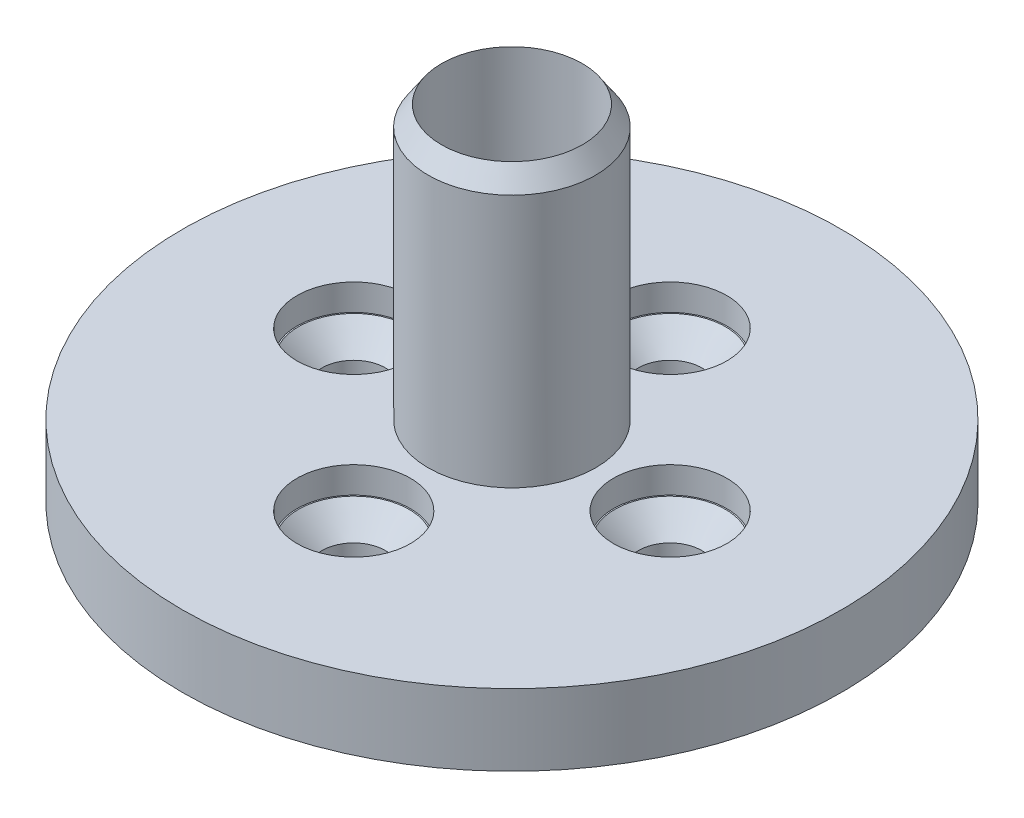
ISO-10303-21;
HEADER;
FILE_DESCRIPTION(('STEP AP214'),'2;1');
FILE_NAME('part.step','',(''),(''),'','','');
FILE_SCHEMA(('AUTOMOTIVE_DESIGN { 1 0 10303 214 1 1 1 1 }'));
ENDSEC;
DATA;
#1=APPLICATION_CONTEXT('core data for automotive mechanical design processes');
#2=APPLICATION_PROTOCOL_DEFINITION('international standard','automotive_design',2000,#1);
#3=PRODUCT_CONTEXT('',#1,'mechanical');
#4=PRODUCT('Part','Part','',(#3));
#5=PRODUCT_RELATED_PRODUCT_CATEGORY('part','',(#4));
#6=PRODUCT_DEFINITION_FORMATION('','',#4);
#7=PRODUCT_DEFINITION_CONTEXT('part definition',#1,'design');
#8=PRODUCT_DEFINITION('design','',#6,#7);
#9=PRODUCT_DEFINITION_SHAPE('','',#8);
#10=(LENGTH_UNIT() NAMED_UNIT(*) SI_UNIT(.MILLI.,.METRE.));
#11=(NAMED_UNIT(*) PLANE_ANGLE_UNIT() SI_UNIT($,.RADIAN.));
#12=(NAMED_UNIT(*) SI_UNIT($,.STERADIAN.) SOLID_ANGLE_UNIT());
#13=UNCERTAINTY_MEASURE_WITH_UNIT(LENGTH_MEASURE(1.E-05),#10,'distance_accuracy_value','');
#14=(GEOMETRIC_REPRESENTATION_CONTEXT(3) GLOBAL_UNCERTAINTY_ASSIGNED_CONTEXT((#13)) GLOBAL_UNIT_ASSIGNED_CONTEXT((#10,
#11,#12)) REPRESENTATION_CONTEXT('',''));
#15=CARTESIAN_POINT('',(0.,0.,0.));
#16=DIRECTION('',(0.,0.,1.));
#17=DIRECTION('',(1.,0.,0.));
#18=AXIS2_PLACEMENT_3D('',#15,#16,#17);
#19=CARTESIAN_POINT('',(6.,2.715,0.));
#20=DIRECTION('',(0.,-1.,0.));
#21=DIRECTION('',(0.,0.,-1.));
#22=AXIS2_PLACEMENT_3D('',#19,#20,#21);
#23=CYLINDRICAL_SURFACE('',#22,1.2);
#24=CARTESIAN_POINT('',(6.,0.814999999999995,0.));
#25=DIRECTION('',(0.,1.,0.));
#26=DIRECTION('',(0.,0.,1.));
#27=AXIS2_PLACEMENT_3D('',#24,#25,#26);
#28=CIRCLE('',#27,1.2);
#29=CARTESIAN_POINT('',(6.,0.814999999999995,1.2));
#30=VERTEX_POINT('',#29);
#31=EDGE_CURVE('E69',#30,#30,#28,.T.);
#32=ORIENTED_EDGE('',*,*,#31,.T.);
#33=EDGE_LOOP('',(#32));
#34=FACE_BOUND('',#33,.T.);
#35=CARTESIAN_POINT('',(6.,0.,0.));
#36=DIRECTION('',(0.,1.,0.));
#37=DIRECTION('',(0.,0.,1.));
#38=AXIS2_PLACEMENT_3D('',#35,#36,#37);
#39=CIRCLE('',#38,1.2);
#40=CARTESIAN_POINT('',(6.,0.,1.2));
#41=VERTEX_POINT('',#40);
#42=EDGE_CURVE('E82',#41,#41,#39,.T.);
#43=ORIENTED_EDGE('',*,*,#42,.F.);
#44=EDGE_LOOP('',(#43));
#45=FACE_BOUND('',#44,.T.);
#46=ADVANCED_FACE('F40',(#34,#45),#23,.F.);
#47=CARTESIAN_POINT('',(0.,2.715,-6.));
#48=DIRECTION('',(0.,-1.,0.));
#49=DIRECTION('',(0.,0.,-1.));
#50=AXIS2_PLACEMENT_3D('',#47,#48,#49);
#51=CYLINDRICAL_SURFACE('',#50,1.2);
#52=CARTESIAN_POINT('',(0.,0.814999999999995,-6.));
#53=DIRECTION('',(0.,1.,0.));
#54=DIRECTION('',(0.,0.,1.));
#55=AXIS2_PLACEMENT_3D('',#52,#53,#54);
#56=CIRCLE('',#55,1.2);
#57=CARTESIAN_POINT('',(0.,0.814999999999995,-4.8));
#58=VERTEX_POINT('',#57);
#59=EDGE_CURVE('E55',#58,#58,#56,.T.);
#60=ORIENTED_EDGE('',*,*,#59,.T.);
#61=EDGE_LOOP('',(#60));
#62=FACE_BOUND('',#61,.T.);
#63=CARTESIAN_POINT('',(0.,0.,-6.));
#64=DIRECTION('',(0.,1.,0.));
#65=DIRECTION('',(0.,0.,1.));
#66=AXIS2_PLACEMENT_3D('',#63,#64,#65);
#67=CIRCLE('',#66,1.2);
#68=CARTESIAN_POINT('',(0.,0.,-4.8));
#69=VERTEX_POINT('',#68);
#70=EDGE_CURVE('E85',#69,#69,#67,.T.);
#71=ORIENTED_EDGE('',*,*,#70,.F.);
#72=EDGE_LOOP('',(#71));
#73=FACE_BOUND('',#72,.T.);
#74=ADVANCED_FACE('F142',(#62,#73),#51,.F.);
#75=CARTESIAN_POINT('',(-6.,2.715,0.));
#76=DIRECTION('',(0.,-1.,0.));
#77=DIRECTION('',(0.,0.,-1.));
#78=AXIS2_PLACEMENT_3D('',#75,#76,#77);
#79=CYLINDRICAL_SURFACE('',#78,1.2);
#80=CARTESIAN_POINT('',(-6.,0.814999999999995,0.));
#81=DIRECTION('',(0.,1.,0.));
#82=DIRECTION('',(0.,0.,1.));
#83=AXIS2_PLACEMENT_3D('',#80,#81,#82);
#84=CIRCLE('',#83,1.2);
#85=CARTESIAN_POINT('',(-6.,0.814999999999995,1.2));
#86=VERTEX_POINT('',#85);
#87=EDGE_CURVE('E63',#86,#86,#84,.T.);
#88=ORIENTED_EDGE('',*,*,#87,.T.);
#89=EDGE_LOOP('',(#88));
#90=FACE_BOUND('',#89,.T.);
#91=CARTESIAN_POINT('',(-6.,0.,0.));
#92=DIRECTION('',(0.,1.,0.));
#93=DIRECTION('',(0.,0.,1.));
#94=AXIS2_PLACEMENT_3D('',#91,#92,#93);
#95=CIRCLE('',#94,1.2);
#96=CARTESIAN_POINT('',(-6.,0.,1.2));
#97=VERTEX_POINT('',#96);
#98=EDGE_CURVE('E88',#97,#97,#95,.T.);
#99=ORIENTED_EDGE('',*,*,#98,.F.);
#100=EDGE_LOOP('',(#99));
#101=FACE_BOUND('',#100,.T.);
#102=ADVANCED_FACE('F148',(#90,#101),#79,.F.);
#103=CARTESIAN_POINT('',(0.,2.715,6.));
#104=DIRECTION('',(0.,-1.,0.));
#105=DIRECTION('',(0.,0.,-1.));
#106=AXIS2_PLACEMENT_3D('',#103,#104,#105);
#107=CYLINDRICAL_SURFACE('',#106,1.2);
#108=CARTESIAN_POINT('',(0.,0.814999999999995,6.));
#109=DIRECTION('',(0.,1.,0.));
#110=DIRECTION('',(0.,0.,1.));
#111=AXIS2_PLACEMENT_3D('',#108,#109,#110);
#112=CIRCLE('',#111,1.2);
#113=CARTESIAN_POINT('',(0.,0.814999999999995,7.2));
#114=VERTEX_POINT('',#113);
#115=EDGE_CURVE('E75',#114,#114,#112,.T.);
#116=ORIENTED_EDGE('',*,*,#115,.T.);
#117=EDGE_LOOP('',(#116));
#118=FACE_BOUND('',#117,.T.);
#119=CARTESIAN_POINT('',(0.,0.,6.));
#120=DIRECTION('',(0.,1.,0.));
#121=DIRECTION('',(0.,0.,1.));
#122=AXIS2_PLACEMENT_3D('',#119,#120,#121);
#123=CIRCLE('',#122,1.2);
#124=CARTESIAN_POINT('',(0.,0.,7.2));
#125=VERTEX_POINT('',#124);
#126=EDGE_CURVE('E91',#125,#125,#123,.T.);
#127=ORIENTED_EDGE('',*,*,#126,.F.);
#128=EDGE_LOOP('',(#127));
#129=FACE_BOUND('',#128,.T.);
#130=ADVANCED_FACE('F158',(#118,#129),#107,.F.);
#131=CARTESIAN_POINT('',(0.,2.715,0.));
#132=DIRECTION('',(0.,-1.,0.));
#133=DIRECTION('',(0.,0.,-1.));
#134=AXIS2_PLACEMENT_3D('',#131,#132,#133);
#135=CYLINDRICAL_SURFACE('',#134,12.5);
#136=CARTESIAN_POINT('',(0.,2.715,0.));
#137=DIRECTION('',(0.,1.,0.));
#138=DIRECTION('',(0.,0.,1.));
#139=AXIS2_PLACEMENT_3D('',#136,#137,#138);
#140=CIRCLE('',#139,12.5);
#141=CARTESIAN_POINT('',(0.,2.715,12.5));
#142=VERTEX_POINT('',#141);
#143=EDGE_CURVE('E78',#142,#142,#140,.T.);
#144=ORIENTED_EDGE('',*,*,#143,.F.);
#145=EDGE_LOOP('',(#144));
#146=FACE_BOUND('',#145,.T.);
#147=CARTESIAN_POINT('',(0.,0.,0.));
#148=DIRECTION('',(0.,1.,0.));
#149=DIRECTION('',(0.,0.,1.));
#150=AXIS2_PLACEMENT_3D('',#147,#148,#149);
#151=CIRCLE('',#150,12.5);
#152=CARTESIAN_POINT('',(0.,0.,12.5));
#153=VERTEX_POINT('',#152);
#154=EDGE_CURVE('E79',#153,#153,#151,.T.);
#155=ORIENTED_EDGE('',*,*,#154,.T.);
#156=EDGE_LOOP('',(#155));
#157=FACE_BOUND('',#156,.T.);
#158=ADVANCED_FACE('F153',(#146,#157),#135,.T.);
#159=CARTESIAN_POINT('',(0.,2.715,0.));
#160=DIRECTION('',(0.,1.,0.));
#161=DIRECTION('',(0.,0.,1.));
#162=AXIS2_PLACEMENT_3D('',#159,#160,#161);
#163=PLANE('',#162);
#164=CARTESIAN_POINT('',(0.,2.715,-6.));
#165=DIRECTION('',(0.,1.,0.));
#166=DIRECTION('',(0.,0.,1.));
#167=AXIS2_PLACEMENT_3D('',#164,#165,#166);
#168=CIRCLE('',#167,2.15);
#169=CARTESIAN_POINT('',(0.,2.715,-3.85));
#170=VERTEX_POINT('',#169);
#171=EDGE_CURVE('E110',#170,#170,#168,.T.);
#172=ORIENTED_EDGE('',*,*,#171,.F.);
#173=EDGE_LOOP('',(#172));
#174=FACE_BOUND('',#173,.T.);
#175=CARTESIAN_POINT('',(0.,2.715,0.));
#176=DIRECTION('',(0.,1.,0.));
#177=DIRECTION('',(0.,0.,1.));
#178=AXIS2_PLACEMENT_3D('',#175,#176,#177);
#179=CIRCLE('',#178,3.175);
#180=CARTESIAN_POINT('',(0.,2.715,3.175));
#181=VERTEX_POINT('',#180);
#182=EDGE_CURVE('E111',#181,#181,#179,.T.);
#183=ORIENTED_EDGE('',*,*,#182,.F.);
#184=EDGE_LOOP('',(#183));
#185=FACE_BOUND('',#184,.T.);
#186=CARTESIAN_POINT('',(0.,2.715,6.));
#187=DIRECTION('',(0.,1.,0.));
#188=DIRECTION('',(0.,0.,1.));
#189=AXIS2_PLACEMENT_3D('',#186,#187,#188);
#190=CIRCLE('',#189,2.15);
#191=CARTESIAN_POINT('',(0.,2.715,8.15));
#192=VERTEX_POINT('',#191);
#193=EDGE_CURVE('E114',#192,#192,#190,.T.);
#194=ORIENTED_EDGE('',*,*,#193,.F.);
#195=EDGE_LOOP('',(#194));
#196=FACE_BOUND('',#195,.T.);
#197=CARTESIAN_POINT('',(6.,2.715,0.));
#198=DIRECTION('',(0.,1.,0.));
#199=DIRECTION('',(0.,0.,1.));
#200=AXIS2_PLACEMENT_3D('',#197,#198,#199);
#201=CIRCLE('',#200,2.15);
#202=CARTESIAN_POINT('',(6.,2.715,2.15));
#203=VERTEX_POINT('',#202);
#204=EDGE_CURVE('E97',#203,#203,#201,.T.);
#205=ORIENTED_EDGE('',*,*,#204,.F.);
#206=EDGE_LOOP('',(#205));
#207=FACE_BOUND('',#206,.T.);
#208=CARTESIAN_POINT('',(-6.,2.715,0.));
#209=DIRECTION('',(0.,1.,0.));
#210=DIRECTION('',(0.,0.,1.));
#211=AXIS2_PLACEMENT_3D('',#208,#209,#210);
#212=CIRCLE('',#211,2.15);
#213=CARTESIAN_POINT('',(-6.,2.715,2.15));
#214=VERTEX_POINT('',#213);
#215=EDGE_CURVE('E104',#214,#214,#212,.T.);
#216=ORIENTED_EDGE('',*,*,#215,.F.);
#217=EDGE_LOOP('',(#216));
#218=FACE_BOUND('',#217,.T.);
#219=ORIENTED_EDGE('',*,*,#143,.T.);
#220=EDGE_LOOP('',(#219));
#221=FACE_BOUND('',#220,.T.);
#222=ADVANCED_FACE('F188',(#174,#185,#196,#207,#218,#221),#163,.T.);
#223=CARTESIAN_POINT('',(0.,0.,0.));
#224=DIRECTION('',(0.,1.,0.));
#225=DIRECTION('',(0.,0.,1.));
#226=AXIS2_PLACEMENT_3D('',#223,#224,#225);
#227=PLANE('',#226);
#228=CARTESIAN_POINT('',(0.,0.,0.));
#229=DIRECTION('',(0.,1.,0.));
#230=DIRECTION('',(0.,0.,1.));
#231=AXIS2_PLACEMENT_3D('',#228,#229,#230);
#232=CIRCLE('',#231,2.67125);
#233=CARTESIAN_POINT('',(0.,0.,2.67125));
#234=VERTEX_POINT('',#233);
#235=EDGE_CURVE('E115',#234,#234,#232,.T.);
#236=ORIENTED_EDGE('',*,*,#235,.T.);
#237=EDGE_LOOP('',(#236));
#238=FACE_BOUND('',#237,.T.);
#239=ORIENTED_EDGE('',*,*,#126,.T.);
#240=EDGE_LOOP('',(#239));
#241=FACE_BOUND('',#240,.T.);
#242=ORIENTED_EDGE('',*,*,#98,.T.);
#243=EDGE_LOOP('',(#242));
#244=FACE_BOUND('',#243,.T.);
#245=ORIENTED_EDGE('',*,*,#70,.T.);
#246=EDGE_LOOP('',(#245));
#247=FACE_BOUND('',#246,.T.);
#248=ORIENTED_EDGE('',*,*,#42,.T.);
#249=EDGE_LOOP('',(#248));
#250=FACE_BOUND('',#249,.T.);
#251=ORIENTED_EDGE('',*,*,#154,.F.);
#252=EDGE_LOOP('',(#251));
#253=FACE_BOUND('',#252,.T.);
#254=ADVANCED_FACE('F127',(#238,#241,#244,#247,#250,#253),#227,.F.);
#255=CARTESIAN_POINT('',(-6.,1.715,0.));
#256=DIRECTION('',(0.,1.,0.));
#257=DIRECTION('',(0.,0.,1.));
#258=AXIS2_PLACEMENT_3D('',#255,#256,#257);
#259=CYLINDRICAL_SURFACE('',#258,2.15);
#260=CARTESIAN_POINT('',(-6.,1.715,0.));
#261=DIRECTION('',(0.,1.,0.));
#262=DIRECTION('',(0.,0.,1.));
#263=AXIS2_PLACEMENT_3D('',#260,#261,#262);
#264=CIRCLE('',#263,2.15);
#265=CARTESIAN_POINT('',(-6.,1.715,2.15));
#266=VERTEX_POINT('',#265);
#267=EDGE_CURVE('E107',#266,#266,#264,.T.);
#268=ORIENTED_EDGE('',*,*,#267,.F.);
#269=EDGE_LOOP('',(#268));
#270=FACE_BOUND('',#269,.T.);
#271=ORIENTED_EDGE('',*,*,#215,.T.);
#272=EDGE_LOOP('',(#271));
#273=FACE_BOUND('',#272,.T.);
#274=ADVANCED_FACE('F187',(#270,#273),#259,.F.);
#275=CARTESIAN_POINT('',(-6.,1.715,0.));
#276=DIRECTION('',(0.,1.,0.));
#277=DIRECTION('',(0.,0.,1.));
#278=AXIS2_PLACEMENT_3D('',#275,#276,#277);
#279=PLANE('',#278);
#280=CARTESIAN_POINT('',(-6.,1.715,0.));
#281=DIRECTION('',(0.,1.,0.));
#282=DIRECTION('',(0.,0.,1.));
#283=AXIS2_PLACEMENT_3D('',#280,#281,#282);
#284=CIRCLE('',#283,2.10000000000001);
#285=CARTESIAN_POINT('',(-6.,1.715,2.10000000000001));
#286=VERTEX_POINT('',#285);
#287=EDGE_CURVE('E60',#286,#286,#284,.F.);
#288=ORIENTED_EDGE('',*,*,#287,.T.);
#289=EDGE_LOOP('',(#288));
#290=FACE_BOUND('',#289,.T.);
#291=ORIENTED_EDGE('',*,*,#267,.T.);
#292=EDGE_LOOP('',(#291));
#293=FACE_BOUND('',#292,.T.);
#294=ADVANCED_FACE('F211',(#290,#293),#279,.T.);
#295=CARTESIAN_POINT('',(6.,1.715,0.));
#296=DIRECTION('',(0.,1.,0.));
#297=DIRECTION('',(0.,0.,1.));
#298=AXIS2_PLACEMENT_3D('',#295,#296,#297);
#299=CYLINDRICAL_SURFACE('',#298,2.15);
#300=CARTESIAN_POINT('',(6.,1.715,0.));
#301=DIRECTION('',(0.,1.,0.));
#302=DIRECTION('',(0.,0.,1.));
#303=AXIS2_PLACEMENT_3D('',#300,#301,#302);
#304=CIRCLE('',#303,2.15);
#305=CARTESIAN_POINT('',(6.,1.715,2.15));
#306=VERTEX_POINT('',#305);
#307=EDGE_CURVE('E100',#306,#306,#304,.T.);
#308=ORIENTED_EDGE('',*,*,#307,.F.);
#309=EDGE_LOOP('',(#308));
#310=FACE_BOUND('',#309,.T.);
#311=ORIENTED_EDGE('',*,*,#204,.T.);
#312=EDGE_LOOP('',(#311));
#313=FACE_BOUND('',#312,.T.);
#314=ADVANCED_FACE('F207',(#310,#313),#299,.F.);
#315=CARTESIAN_POINT('',(6.,1.715,0.));
#316=DIRECTION('',(0.,1.,0.));
#317=DIRECTION('',(0.,0.,1.));
#318=AXIS2_PLACEMENT_3D('',#315,#316,#317);
#319=PLANE('',#318);
#320=CARTESIAN_POINT('',(6.,1.715,0.));
#321=DIRECTION('',(0.,1.,0.));
#322=DIRECTION('',(0.,0.,1.));
#323=AXIS2_PLACEMENT_3D('',#320,#321,#322);
#324=CIRCLE('',#323,2.10000000000001);
#325=CARTESIAN_POINT('',(6.,1.715,2.10000000000001));
#326=VERTEX_POINT('',#325);
#327=EDGE_CURVE('E66',#326,#326,#324,.F.);
#328=ORIENTED_EDGE('',*,*,#327,.T.);
#329=EDGE_LOOP('',(#328));
#330=FACE_BOUND('',#329,.T.);
#331=ORIENTED_EDGE('',*,*,#307,.T.);
#332=EDGE_LOOP('',(#331));
#333=FACE_BOUND('',#332,.T.);
#334=ADVANCED_FACE('F210',(#330,#333),#319,.T.);
#335=CARTESIAN_POINT('',(0.,1.715,6.));
#336=DIRECTION('',(0.,1.,0.));
#337=DIRECTION('',(0.,0.,1.));
#338=AXIS2_PLACEMENT_3D('',#335,#336,#337);
#339=CYLINDRICAL_SURFACE('',#338,2.15);
#340=CARTESIAN_POINT('',(0.,1.715,6.));
#341=DIRECTION('',(0.,1.,0.));
#342=DIRECTION('',(0.,0.,1.));
#343=AXIS2_PLACEMENT_3D('',#340,#341,#342);
#344=CIRCLE('',#343,2.15);
#345=CARTESIAN_POINT('',(0.,1.715,8.15));
#346=VERTEX_POINT('',#345);
#347=EDGE_CURVE('E101',#346,#346,#344,.T.);
#348=ORIENTED_EDGE('',*,*,#347,.F.);
#349=EDGE_LOOP('',(#348));
#350=FACE_BOUND('',#349,.T.);
#351=ORIENTED_EDGE('',*,*,#193,.T.);
#352=EDGE_LOOP('',(#351));
#353=FACE_BOUND('',#352,.T.);
#354=ADVANCED_FACE('F215',(#350,#353),#339,.F.);
#355=CARTESIAN_POINT('',(0.,1.715,6.));
#356=DIRECTION('',(0.,1.,0.));
#357=DIRECTION('',(0.,0.,1.));
#358=AXIS2_PLACEMENT_3D('',#355,#356,#357);
#359=PLANE('',#358);
#360=CARTESIAN_POINT('',(0.,1.715,6.));
#361=DIRECTION('',(0.,1.,0.));
#362=DIRECTION('',(0.,0.,1.));
#363=AXIS2_PLACEMENT_3D('',#360,#361,#362);
#364=CIRCLE('',#363,2.10000000000001);
#365=CARTESIAN_POINT('',(0.,1.715,8.10000000000001));
#366=VERTEX_POINT('',#365);
#367=EDGE_CURVE('E72',#366,#366,#364,.F.);
#368=ORIENTED_EDGE('',*,*,#367,.T.);
#369=EDGE_LOOP('',(#368));
#370=FACE_BOUND('',#369,.T.);
#371=ORIENTED_EDGE('',*,*,#347,.T.);
#372=EDGE_LOOP('',(#371));
#373=FACE_BOUND('',#372,.T.);
#374=ADVANCED_FACE('F225',(#370,#373),#359,.T.);
#375=CARTESIAN_POINT('',(0.,1.715,-6.));
#376=DIRECTION('',(0.,1.,0.));
#377=DIRECTION('',(0.,0.,1.));
#378=AXIS2_PLACEMENT_3D('',#375,#376,#377);
#379=CYLINDRICAL_SURFACE('',#378,2.15);
#380=CARTESIAN_POINT('',(0.,1.715,-6.));
#381=DIRECTION('',(0.,1.,0.));
#382=DIRECTION('',(0.,0.,1.));
#383=AXIS2_PLACEMENT_3D('',#380,#381,#382);
#384=CIRCLE('',#383,2.15);
#385=CARTESIAN_POINT('',(0.,1.715,-3.85));
#386=VERTEX_POINT('',#385);
#387=EDGE_CURVE('E94',#386,#386,#384,.T.);
#388=ORIENTED_EDGE('',*,*,#387,.F.);
#389=EDGE_LOOP('',(#388));
#390=FACE_BOUND('',#389,.T.);
#391=ORIENTED_EDGE('',*,*,#171,.T.);
#392=EDGE_LOOP('',(#391));
#393=FACE_BOUND('',#392,.T.);
#394=ADVANCED_FACE('F229',(#390,#393),#379,.F.);
#395=CARTESIAN_POINT('',(0.,1.715,-6.));
#396=DIRECTION('',(0.,1.,0.));
#397=DIRECTION('',(0.,0.,1.));
#398=AXIS2_PLACEMENT_3D('',#395,#396,#397);
#399=PLANE('',#398);
#400=CARTESIAN_POINT('',(0.,1.715,-6.));
#401=DIRECTION('',(0.,1.,0.));
#402=DIRECTION('',(0.,0.,1.));
#403=AXIS2_PLACEMENT_3D('',#400,#401,#402);
#404=CIRCLE('',#403,2.10000000000001);
#405=CARTESIAN_POINT('',(0.,1.715,-3.89999999999999));
#406=VERTEX_POINT('',#405);
#407=EDGE_CURVE('E51',#406,#406,#404,.F.);
#408=ORIENTED_EDGE('',*,*,#407,.T.);
#409=EDGE_LOOP('',(#408));
#410=FACE_BOUND('',#409,.T.);
#411=ORIENTED_EDGE('',*,*,#387,.T.);
#412=EDGE_LOOP('',(#411));
#413=FACE_BOUND('',#412,.T.);
#414=ADVANCED_FACE('F167',(#410,#413),#399,.T.);
#415=CARTESIAN_POINT('',(0.,0.814999999999995,6.));
#416=DIRECTION('',(0.,1.,0.));
#417=DIRECTION('',(0.,0.,1.));
#418=AXIS2_PLACEMENT_3D('',#415,#416,#417);
#419=CONICAL_SURFACE('',#418,1.2,0.78539816339745);
#420=ORIENTED_EDGE('',*,*,#367,.F.);
#421=EDGE_LOOP('',(#420));
#422=FACE_BOUND('',#421,.T.);
#423=ORIENTED_EDGE('',*,*,#115,.F.);
#424=EDGE_LOOP('',(#423));
#425=FACE_BOUND('',#424,.T.);
#426=ADVANCED_FACE('F163',(#422,#425),#419,.F.);
#427=CARTESIAN_POINT('',(6.,0.814999999999995,0.));
#428=DIRECTION('',(0.,1.,0.));
#429=DIRECTION('',(0.,0.,1.));
#430=AXIS2_PLACEMENT_3D('',#427,#428,#429);
#431=CONICAL_SURFACE('',#430,1.2,0.78539816339745);
#432=ORIENTED_EDGE('',*,*,#327,.F.);
#433=EDGE_LOOP('',(#432));
#434=FACE_BOUND('',#433,.T.);
#435=ORIENTED_EDGE('',*,*,#31,.F.);
#436=EDGE_LOOP('',(#435));
#437=FACE_BOUND('',#436,.T.);
#438=ADVANCED_FACE('F166',(#434,#437),#431,.F.);
#439=CARTESIAN_POINT('',(-6.,0.814999999999995,0.));
#440=DIRECTION('',(0.,1.,0.));
#441=DIRECTION('',(0.,0.,1.));
#442=AXIS2_PLACEMENT_3D('',#439,#440,#441);
#443=CONICAL_SURFACE('',#442,1.2,0.78539816339745);
#444=ORIENTED_EDGE('',*,*,#287,.F.);
#445=EDGE_LOOP('',(#444));
#446=FACE_BOUND('',#445,.T.);
#447=ORIENTED_EDGE('',*,*,#87,.F.);
#448=EDGE_LOOP('',(#447));
#449=FACE_BOUND('',#448,.T.);
#450=ADVANCED_FACE('F171',(#446,#449),#443,.F.);
#451=CARTESIAN_POINT('',(0.,0.814999999999995,-6.));
#452=DIRECTION('',(0.,1.,0.));
#453=DIRECTION('',(0.,0.,1.));
#454=AXIS2_PLACEMENT_3D('',#451,#452,#453);
#455=CONICAL_SURFACE('',#454,1.2,0.78539816339745);
#456=ORIENTED_EDGE('',*,*,#407,.F.);
#457=EDGE_LOOP('',(#456));
#458=FACE_BOUND('',#457,.T.);
#459=ORIENTED_EDGE('',*,*,#59,.F.);
#460=EDGE_LOOP('',(#459));
#461=FACE_BOUND('',#460,.T.);
#462=ADVANCED_FACE('F139',(#458,#461),#455,.F.);
#463=CARTESIAN_POINT('',(0.,13.81,0.));
#464=DIRECTION('',(0.,-1.,0.));
#465=DIRECTION('',(0.,0.,-1.));
#466=AXIS2_PLACEMENT_3D('',#463,#464,#465);
#467=CYLINDRICAL_SURFACE('',#466,3.175);
#468=CARTESIAN_POINT('',(0.,12.3274390314872,0.));
#469=DIRECTION('',(0.,-1.,0.));
#470=DIRECTION('',(0.,0.,-1.));
#471=AXIS2_PLACEMENT_3D('',#468,#469,#470);
#472=CIRCLE('',#471,3.175);
#473=CARTESIAN_POINT('',(0.,12.3274390314872,-3.175));
#474=VERTEX_POINT('',#473);
#475=EDGE_CURVE('E47',#474,#474,#472,.T.);
#476=ORIENTED_EDGE('',*,*,#475,.T.);
#477=EDGE_LOOP('',(#476));
#478=FACE_BOUND('',#477,.T.);
#479=ORIENTED_EDGE('',*,*,#182,.T.);
#480=EDGE_LOOP('',(#479));
#481=FACE_BOUND('',#480,.T.);
#482=ADVANCED_FACE('F132',(#478,#481),#467,.T.);
#483=CARTESIAN_POINT('',(0.,0.,0.));
#484=DIRECTION('',(0.,1.,0.));
#485=DIRECTION('',(0.,0.,1.));
#486=AXIS2_PLACEMENT_3D('',#483,#484,#485);
#487=CYLINDRICAL_SURFACE('',#486,2.67125);
#488=CARTESIAN_POINT('',(0.,13.0742791193755,0.));
#489=DIRECTION('',(0.,-1.,0.));
#490=DIRECTION('',(0.,0.,-1.));
#491=AXIS2_PLACEMENT_3D('',#488,#489,#490);
#492=CIRCLE('',#491,2.67125);
#493=CARTESIAN_POINT('',(0.,13.0742791193755,-2.67125));
#494=VERTEX_POINT('',#493);
#495=EDGE_CURVE('E10',#494,#494,#492,.F.);
#496=ORIENTED_EDGE('',*,*,#495,.T.);
#497=EDGE_LOOP('',(#496));
#498=FACE_BOUND('',#497,.T.);
#499=ORIENTED_EDGE('',*,*,#235,.F.);
#500=EDGE_LOOP('',(#499));
#501=FACE_BOUND('',#500,.T.);
#502=ADVANCED_FACE('F130',(#498,#501),#487,.F.);
#503=CARTESIAN_POINT('',(0.,12.3274390314872,0.));
#504=DIRECTION('',(0.,-1.,0.));
#505=DIRECTION('',(0.,0.,-1.));
#506=AXIS2_PLACEMENT_3D('',#503,#504,#505);
#507=CONICAL_SURFACE('',#506,3.175,0.593411945678068);
#508=ORIENTED_EDGE('',*,*,#495,.F.);
#509=EDGE_LOOP('',(#508));
#510=FACE_BOUND('',#509,.T.);
#511=ORIENTED_EDGE('',*,*,#475,.F.);
#512=EDGE_LOOP('',(#511));
#513=FACE_BOUND('',#512,.T.);
#514=ADVANCED_FACE('F42',(#510,#513),#507,.T.);
#515=CLOSED_SHELL('',(#46,#74,#102,#130,#158,#222,#254,#274,#294,#314,#334,#354,#374,#394,#414,
#426,#438,#450,#462,#482,#502,#514));
#516=MANIFOLD_SOLID_BREP('B2',#515);
#517=ADVANCED_BREP_SHAPE_REPRESENTATION('',(#18,#516),#14);
#518=SHAPE_DEFINITION_REPRESENTATION(#9,#517);
ENDSEC;
END-ISO-10303-21;
